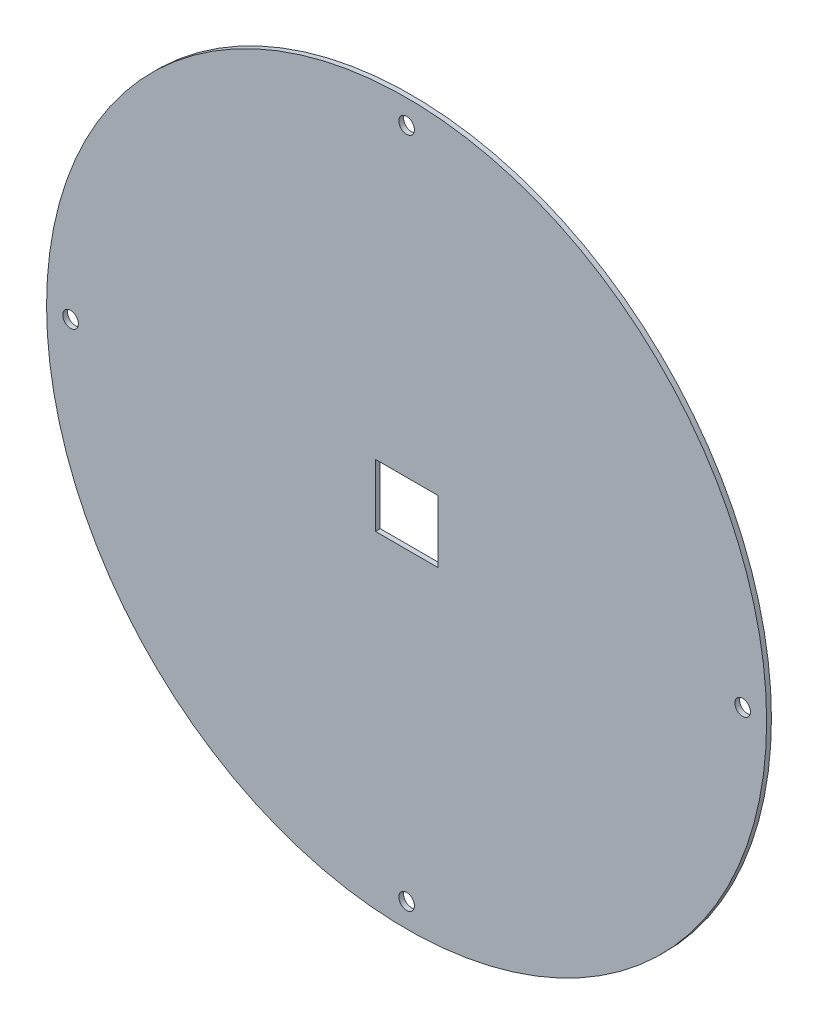
ISO-10303-21;
HEADER;
FILE_DESCRIPTION(('STEP AP214'),'2;1');
FILE_NAME('part.step','',(''),(''),'','','');
FILE_SCHEMA(('AUTOMOTIVE_DESIGN { 1 0 10303 214 1 1 1 1 }'));
ENDSEC;
DATA;
#1=APPLICATION_CONTEXT('core data for automotive mechanical design processes');
#2=APPLICATION_PROTOCOL_DEFINITION('international standard','automotive_design',2000,#1);
#3=PRODUCT_CONTEXT('',#1,'mechanical');
#4=PRODUCT('Part','Part','',(#3));
#5=PRODUCT_RELATED_PRODUCT_CATEGORY('part','',(#4));
#6=PRODUCT_DEFINITION_FORMATION('','',#4);
#7=PRODUCT_DEFINITION_CONTEXT('part definition',#1,'design');
#8=PRODUCT_DEFINITION('design','',#6,#7);
#9=PRODUCT_DEFINITION_SHAPE('','',#8);
#10=(LENGTH_UNIT() NAMED_UNIT(*) SI_UNIT(.MILLI.,.METRE.));
#11=(NAMED_UNIT(*) PLANE_ANGLE_UNIT() SI_UNIT($,.RADIAN.));
#12=(NAMED_UNIT(*) SI_UNIT($,.STERADIAN.) SOLID_ANGLE_UNIT());
#13=UNCERTAINTY_MEASURE_WITH_UNIT(LENGTH_MEASURE(1.E-05),#10,'distance_accuracy_value','');
#14=(GEOMETRIC_REPRESENTATION_CONTEXT(3) GLOBAL_UNCERTAINTY_ASSIGNED_CONTEXT((#13)) GLOBAL_UNIT_ASSIGNED_CONTEXT((#10,
#11,#12)) REPRESENTATION_CONTEXT('',''));
#15=CARTESIAN_POINT('',(0.,0.,0.));
#16=DIRECTION('',(0.,0.,1.));
#17=DIRECTION('',(1.,0.,0.));
#18=AXIS2_PLACEMENT_3D('',#15,#16,#17);
#19=CARTESIAN_POINT('',(0.,0.,2.));
#20=DIRECTION('',(0.,0.,1.));
#21=DIRECTION('',(1.,0.,0.));
#22=AXIS2_PLACEMENT_3D('',#19,#20,#21);
#23=PLANE('',#22);
#24=DIRECTION('',(0.,-1.,0.));
#25=VECTOR('',#24,1.);
#26=CARTESIAN_POINT('',(-13.,13.,2.));
#27=LINE('',#26,#25);
#28=CARTESIAN_POINT('',(-13.,13.,2.));
#29=VERTEX_POINT('',#28);
#30=CARTESIAN_POINT('',(-13.,-13.,2.));
#31=VERTEX_POINT('',#30);
#32=EDGE_CURVE('E59',#29,#31,#27,.T.);
#33=ORIENTED_EDGE('',*,*,#32,.F.);
#34=DIRECTION('',(-1.,0.,0.));
#35=VECTOR('',#34,1.);
#36=CARTESIAN_POINT('',(-13.,13.,2.));
#37=LINE('',#36,#35);
#38=CARTESIAN_POINT('',(13.,13.,2.));
#39=VERTEX_POINT('',#38);
#40=EDGE_CURVE('E106',#39,#29,#37,.T.);
#41=ORIENTED_EDGE('',*,*,#40,.F.);
#42=DIRECTION('',(0.,1.,0.));
#43=VECTOR('',#42,1.);
#44=CARTESIAN_POINT('',(13.,13.,2.));
#45=LINE('',#44,#43);
#46=CARTESIAN_POINT('',(13.,-13.,2.));
#47=VERTEX_POINT('',#46);
#48=EDGE_CURVE('E110',#47,#39,#45,.T.);
#49=ORIENTED_EDGE('',*,*,#48,.F.);
#50=DIRECTION('',(1.,0.,0.));
#51=VECTOR('',#50,1.);
#52=CARTESIAN_POINT('',(-13.,-13.,2.));
#53=LINE('',#52,#51);
#54=EDGE_CURVE('E119',#31,#47,#53,.T.);
#55=ORIENTED_EDGE('',*,*,#54,.F.);
#56=EDGE_LOOP('',(#33,#41,#49,#55));
#57=FACE_BOUND('',#56,.T.);
#58=CARTESIAN_POINT('',(-140.,9.77614774876077E-13,2.));
#59=DIRECTION('',(0.,0.,1.));
#60=DIRECTION('',(1.,0.,0.));
#61=AXIS2_PLACEMENT_3D('',#58,#59,#60);
#62=CIRCLE('',#61,3.25);
#63=CARTESIAN_POINT('',(-136.75,9.77614774876077E-13,2.));
#64=VERTEX_POINT('',#63);
#65=EDGE_CURVE('E142',#64,#64,#62,.T.);
#66=ORIENTED_EDGE('',*,*,#65,.F.);
#67=EDGE_LOOP('',(#66));
#68=FACE_BOUND('',#67,.T.);
#69=CARTESIAN_POINT('',(140.,0.,2.));
#70=DIRECTION('',(0.,0.,1.));
#71=DIRECTION('',(1.,0.,0.));
#72=AXIS2_PLACEMENT_3D('',#69,#70,#71);
#73=CIRCLE('',#72,3.25000000000001);
#74=CARTESIAN_POINT('',(143.25,0.,2.));
#75=VERTEX_POINT('',#74);
#76=EDGE_CURVE('E158',#75,#75,#73,.T.);
#77=ORIENTED_EDGE('',*,*,#76,.F.);
#78=EDGE_LOOP('',(#77));
#79=FACE_BOUND('',#78,.T.);
#80=CARTESIAN_POINT('',(0.,0.,2.));
#81=DIRECTION('',(0.,0.,1.));
#82=DIRECTION('',(1.,0.,0.));
#83=AXIS2_PLACEMENT_3D('',#80,#81,#82);
#84=CIRCLE('',#83,150.);
#85=CARTESIAN_POINT('',(150.,0.,2.));
#86=VERTEX_POINT('',#85);
#87=EDGE_CURVE('E11',#86,#86,#84,.T.);
#88=ORIENTED_EDGE('',*,*,#87,.T.);
#89=EDGE_LOOP('',(#88));
#90=FACE_BOUND('',#89,.T.);
#91=CARTESIAN_POINT('',(-4.88807387438039E-13,-140.,2.));
#92=DIRECTION('',(0.,0.,1.));
#93=DIRECTION('',(1.,0.,0.));
#94=AXIS2_PLACEMENT_3D('',#91,#92,#93);
#95=CIRCLE('',#94,3.25);
#96=CARTESIAN_POINT('',(3.24999999999952,-140.,2.));
#97=VERTEX_POINT('',#96);
#98=EDGE_CURVE('E150',#97,#97,#95,.T.);
#99=ORIENTED_EDGE('',*,*,#98,.F.);
#100=EDGE_LOOP('',(#99));
#101=FACE_BOUND('',#100,.T.);
#102=CARTESIAN_POINT('',(1.46642216231412E-12,140.,2.));
#103=DIRECTION('',(0.,0.,1.));
#104=DIRECTION('',(1.,0.,0.));
#105=AXIS2_PLACEMENT_3D('',#102,#103,#104);
#106=CIRCLE('',#105,3.25);
#107=CARTESIAN_POINT('',(3.25000000000146,140.,2.));
#108=VERTEX_POINT('',#107);
#109=EDGE_CURVE('E134',#108,#108,#106,.T.);
#110=ORIENTED_EDGE('',*,*,#109,.F.);
#111=EDGE_LOOP('',(#110));
#112=FACE_BOUND('',#111,.T.);
#113=ADVANCED_FACE('F43',(#57,#68,#79,#90,#101,#112),#23,.T.);
#114=CARTESIAN_POINT('',(0.,0.,0.));
#115=DIRECTION('',(0.,0.,1.));
#116=DIRECTION('',(1.,0.,0.));
#117=AXIS2_PLACEMENT_3D('',#114,#115,#116);
#118=PLANE('',#117);
#119=DIRECTION('',(-1.,0.,0.));
#120=VECTOR('',#119,1.);
#121=CARTESIAN_POINT('',(-13.,13.,0.));
#122=LINE('',#121,#120);
#123=CARTESIAN_POINT('',(13.,13.,0.));
#124=VERTEX_POINT('',#123);
#125=CARTESIAN_POINT('',(-13.,13.,0.));
#126=VERTEX_POINT('',#125);
#127=EDGE_CURVE('E94',#124,#126,#122,.T.);
#128=ORIENTED_EDGE('',*,*,#127,.T.);
#129=DIRECTION('',(0.,-1.,0.));
#130=VECTOR('',#129,1.);
#131=CARTESIAN_POINT('',(-13.,13.,0.));
#132=LINE('',#131,#130);
#133=CARTESIAN_POINT('',(-13.,-13.,0.));
#134=VERTEX_POINT('',#133);
#135=EDGE_CURVE('E87',#126,#134,#132,.T.);
#136=ORIENTED_EDGE('',*,*,#135,.T.);
#137=DIRECTION('',(1.,0.,0.));
#138=VECTOR('',#137,1.);
#139=CARTESIAN_POINT('',(-13.,-13.,0.));
#140=LINE('',#139,#138);
#141=CARTESIAN_POINT('',(13.,-13.,0.));
#142=VERTEX_POINT('',#141);
#143=EDGE_CURVE('E97',#134,#142,#140,.T.);
#144=ORIENTED_EDGE('',*,*,#143,.T.);
#145=DIRECTION('',(0.,1.,0.));
#146=VECTOR('',#145,1.);
#147=CARTESIAN_POINT('',(13.,13.,0.));
#148=LINE('',#147,#146);
#149=EDGE_CURVE('E67',#142,#124,#148,.T.);
#150=ORIENTED_EDGE('',*,*,#149,.T.);
#151=EDGE_LOOP('',(#128,#136,#144,#150));
#152=FACE_BOUND('',#151,.T.);
#153=CARTESIAN_POINT('',(0.,0.,0.));
#154=DIRECTION('',(0.,0.,1.));
#155=DIRECTION('',(1.,0.,0.));
#156=AXIS2_PLACEMENT_3D('',#153,#154,#155);
#157=CIRCLE('',#156,150.);
#158=CARTESIAN_POINT('',(150.,0.,0.));
#159=VERTEX_POINT('',#158);
#160=EDGE_CURVE('E47',#159,#159,#157,.T.);
#161=ORIENTED_EDGE('',*,*,#160,.F.);
#162=EDGE_LOOP('',(#161));
#163=FACE_BOUND('',#162,.T.);
#164=CARTESIAN_POINT('',(140.,0.,0.));
#165=DIRECTION('',(0.,0.,1.));
#166=DIRECTION('',(1.,0.,0.));
#167=AXIS2_PLACEMENT_3D('',#164,#165,#166);
#168=CIRCLE('',#167,3.25000000000001);
#169=CARTESIAN_POINT('',(143.25,0.,0.));
#170=VERTEX_POINT('',#169);
#171=EDGE_CURVE('E154',#170,#170,#168,.T.);
#172=ORIENTED_EDGE('',*,*,#171,.T.);
#173=EDGE_LOOP('',(#172));
#174=FACE_BOUND('',#173,.T.);
#175=CARTESIAN_POINT('',(-4.88807387438039E-13,-140.,0.));
#176=DIRECTION('',(0.,0.,1.));
#177=DIRECTION('',(1.,0.,0.));
#178=AXIS2_PLACEMENT_3D('',#175,#176,#177);
#179=CIRCLE('',#178,3.25);
#180=CARTESIAN_POINT('',(3.24999999999952,-140.,0.));
#181=VERTEX_POINT('',#180);
#182=EDGE_CURVE('E146',#181,#181,#179,.T.);
#183=ORIENTED_EDGE('',*,*,#182,.T.);
#184=EDGE_LOOP('',(#183));
#185=FACE_BOUND('',#184,.T.);
#186=CARTESIAN_POINT('',(-140.,9.77614774876077E-13,0.));
#187=DIRECTION('',(0.,0.,1.));
#188=DIRECTION('',(1.,0.,0.));
#189=AXIS2_PLACEMENT_3D('',#186,#187,#188);
#190=CIRCLE('',#189,3.25);
#191=CARTESIAN_POINT('',(-136.75,9.77614774876077E-13,0.));
#192=VERTEX_POINT('',#191);
#193=EDGE_CURVE('E138',#192,#192,#190,.T.);
#194=ORIENTED_EDGE('',*,*,#193,.T.);
#195=EDGE_LOOP('',(#194));
#196=FACE_BOUND('',#195,.T.);
#197=CARTESIAN_POINT('',(1.46642216231412E-12,140.,0.));
#198=DIRECTION('',(0.,0.,1.));
#199=DIRECTION('',(1.,0.,0.));
#200=AXIS2_PLACEMENT_3D('',#197,#198,#199);
#201=CIRCLE('',#200,3.25);
#202=CARTESIAN_POINT('',(3.25000000000146,140.,0.));
#203=VERTEX_POINT('',#202);
#204=EDGE_CURVE('E128',#203,#203,#201,.T.);
#205=ORIENTED_EDGE('',*,*,#204,.T.);
#206=EDGE_LOOP('',(#205));
#207=FACE_BOUND('',#206,.T.);
#208=ADVANCED_FACE('F102',(#152,#163,#174,#185,#196,#207),#118,.F.);
#209=CARTESIAN_POINT('',(0.,0.,2.));
#210=DIRECTION('',(0.,0.,-1.));
#211=DIRECTION('',(-1.,0.,0.));
#212=AXIS2_PLACEMENT_3D('',#209,#210,#211);
#213=CYLINDRICAL_SURFACE('',#212,150.);
#214=ORIENTED_EDGE('',*,*,#87,.F.);
#215=EDGE_LOOP('',(#214));
#216=FACE_BOUND('',#215,.T.);
#217=ORIENTED_EDGE('',*,*,#160,.T.);
#218=EDGE_LOOP('',(#217));
#219=FACE_BOUND('',#218,.T.);
#220=ADVANCED_FACE('F45',(#216,#219),#213,.T.);
#221=CARTESIAN_POINT('',(140.,0.,2.));
#222=DIRECTION('',(0.,0.,-1.));
#223=DIRECTION('',(-1.,0.,0.));
#224=AXIS2_PLACEMENT_3D('',#221,#222,#223);
#225=CYLINDRICAL_SURFACE('',#224,3.25000000000001);
#226=ORIENTED_EDGE('',*,*,#76,.T.);
#227=EDGE_LOOP('',(#226));
#228=FACE_BOUND('',#227,.T.);
#229=ORIENTED_EDGE('',*,*,#171,.F.);
#230=EDGE_LOOP('',(#229));
#231=FACE_BOUND('',#230,.T.);
#232=ADVANCED_FACE('F168',(#228,#231),#225,.F.);
#233=CARTESIAN_POINT('',(-4.88807387438039E-13,-140.,2.));
#234=DIRECTION('',(0.,0.,-1.));
#235=DIRECTION('',(-1.,0.,0.));
#236=AXIS2_PLACEMENT_3D('',#233,#234,#235);
#237=CYLINDRICAL_SURFACE('',#236,3.25);
#238=ORIENTED_EDGE('',*,*,#98,.T.);
#239=EDGE_LOOP('',(#238));
#240=FACE_BOUND('',#239,.T.);
#241=ORIENTED_EDGE('',*,*,#182,.F.);
#242=EDGE_LOOP('',(#241));
#243=FACE_BOUND('',#242,.T.);
#244=ADVANCED_FACE('F170',(#240,#243),#237,.F.);
#245=CARTESIAN_POINT('',(-140.,9.77614774876077E-13,2.));
#246=DIRECTION('',(0.,0.,-1.));
#247=DIRECTION('',(-1.,0.,0.));
#248=AXIS2_PLACEMENT_3D('',#245,#246,#247);
#249=CYLINDRICAL_SURFACE('',#248,3.25);
#250=ORIENTED_EDGE('',*,*,#65,.T.);
#251=EDGE_LOOP('',(#250));
#252=FACE_BOUND('',#251,.T.);
#253=ORIENTED_EDGE('',*,*,#193,.F.);
#254=EDGE_LOOP('',(#253));
#255=FACE_BOUND('',#254,.T.);
#256=ADVANCED_FACE('F177',(#252,#255),#249,.F.);
#257=CARTESIAN_POINT('',(1.46642216231412E-12,140.,2.));
#258=DIRECTION('',(0.,0.,-1.));
#259=DIRECTION('',(-1.,0.,0.));
#260=AXIS2_PLACEMENT_3D('',#257,#258,#259);
#261=CYLINDRICAL_SURFACE('',#260,3.25);
#262=ORIENTED_EDGE('',*,*,#109,.T.);
#263=EDGE_LOOP('',(#262));
#264=FACE_BOUND('',#263,.T.);
#265=ORIENTED_EDGE('',*,*,#204,.F.);
#266=EDGE_LOOP('',(#265));
#267=FACE_BOUND('',#266,.T.);
#268=ADVANCED_FACE('F199',(#264,#267),#261,.F.);
#269=CARTESIAN_POINT('',(-13.,13.,0.));
#270=DIRECTION('',(-1.,0.,0.));
#271=DIRECTION('',(0.,0.,1.));
#272=AXIS2_PLACEMENT_3D('',#269,#270,#271);
#273=PLANE('',#272);
#274=ORIENTED_EDGE('',*,*,#32,.T.);
#275=DIRECTION('',(0.,0.,1.));
#276=VECTOR('',#275,1.);
#277=CARTESIAN_POINT('',(-13.,-13.,0.));
#278=LINE('',#277,#276);
#279=EDGE_CURVE('E83',#134,#31,#278,.T.);
#280=ORIENTED_EDGE('',*,*,#279,.F.);
#281=ORIENTED_EDGE('',*,*,#135,.F.);
#282=DIRECTION('',(0.,0.,1.));
#283=VECTOR('',#282,1.);
#284=CARTESIAN_POINT('',(-13.,13.,0.));
#285=LINE('',#284,#283);
#286=EDGE_CURVE('E125',#126,#29,#285,.T.);
#287=ORIENTED_EDGE('',*,*,#286,.T.);
#288=EDGE_LOOP('',(#274,#280,#281,#287));
#289=FACE_BOUND('',#288,.T.);
#290=ADVANCED_FACE('F85',(#289),#273,.F.);
#291=CARTESIAN_POINT('',(-13.,13.,0.));
#292=DIRECTION('',(0.,1.,0.));
#293=DIRECTION('',(0.,0.,1.));
#294=AXIS2_PLACEMENT_3D('',#291,#292,#293);
#295=PLANE('',#294);
#296=ORIENTED_EDGE('',*,*,#40,.T.);
#297=ORIENTED_EDGE('',*,*,#286,.F.);
#298=ORIENTED_EDGE('',*,*,#127,.F.);
#299=DIRECTION('',(0.,0.,1.));
#300=VECTOR('',#299,1.);
#301=CARTESIAN_POINT('',(13.,13.,0.));
#302=LINE('',#301,#300);
#303=EDGE_CURVE('E129',#124,#39,#302,.T.);
#304=ORIENTED_EDGE('',*,*,#303,.T.);
#305=EDGE_LOOP('',(#296,#297,#298,#304));
#306=FACE_BOUND('',#305,.T.);
#307=ADVANCED_FACE('F209',(#306),#295,.F.);
#308=CARTESIAN_POINT('',(13.,13.,0.));
#309=DIRECTION('',(1.,0.,0.));
#310=DIRECTION('',(0.,0.,-1.));
#311=AXIS2_PLACEMENT_3D('',#308,#309,#310);
#312=PLANE('',#311);
#313=ORIENTED_EDGE('',*,*,#48,.T.);
#314=ORIENTED_EDGE('',*,*,#303,.F.);
#315=ORIENTED_EDGE('',*,*,#149,.F.);
#316=DIRECTION('',(0.,0.,1.));
#317=VECTOR('',#316,1.);
#318=CARTESIAN_POINT('',(13.,-13.,0.));
#319=LINE('',#318,#317);
#320=EDGE_CURVE('E93',#142,#47,#319,.T.);
#321=ORIENTED_EDGE('',*,*,#320,.T.);
#322=EDGE_LOOP('',(#313,#314,#315,#321));
#323=FACE_BOUND('',#322,.T.);
#324=ADVANCED_FACE('F216',(#323),#312,.F.);
#325=CARTESIAN_POINT('',(-13.,-13.,0.));
#326=DIRECTION('',(0.,-1.,0.));
#327=DIRECTION('',(0.,0.,-1.));
#328=AXIS2_PLACEMENT_3D('',#325,#326,#327);
#329=PLANE('',#328);
#330=ORIENTED_EDGE('',*,*,#54,.T.);
#331=ORIENTED_EDGE('',*,*,#320,.F.);
#332=ORIENTED_EDGE('',*,*,#143,.F.);
#333=ORIENTED_EDGE('',*,*,#279,.T.);
#334=EDGE_LOOP('',(#330,#331,#332,#333));
#335=FACE_BOUND('',#334,.T.);
#336=ADVANCED_FACE('F98',(#335),#329,.F.);
#337=CLOSED_SHELL('',(#113,#208,#220,#232,#244,#256,#268,#290,#307,#324,#336));
#338=MANIFOLD_SOLID_BREP('B2',#337);
#339=ADVANCED_BREP_SHAPE_REPRESENTATION('',(#18,#338),#14);
#340=SHAPE_DEFINITION_REPRESENTATION(#9,#339);
ENDSEC;
END-ISO-10303-21;
